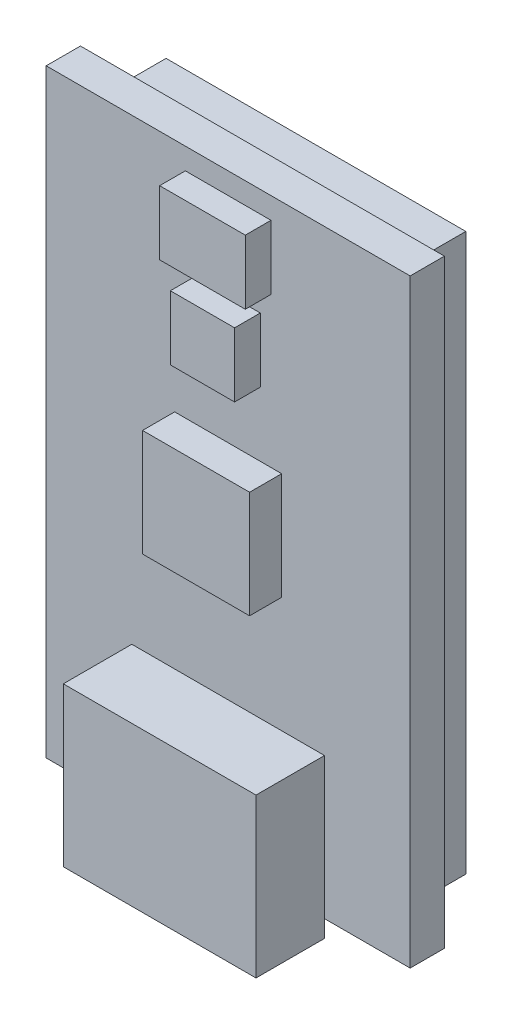
ISO-10303-21;
HEADER;
FILE_DESCRIPTION(('STEP AP214'),'2;1');
FILE_NAME('part.step','',(''),(''),'','','');
FILE_SCHEMA(('AUTOMOTIVE_DESIGN { 1 0 10303 214 1 1 1 1 }'));
ENDSEC;
DATA;
#1=APPLICATION_CONTEXT('core data for automotive mechanical design processes');
#2=APPLICATION_PROTOCOL_DEFINITION('international standard','automotive_design',2000,#1);
#3=PRODUCT_CONTEXT('',#1,'mechanical');
#4=PRODUCT('Part','Part','',(#3));
#5=PRODUCT_RELATED_PRODUCT_CATEGORY('part','',(#4));
#6=PRODUCT_DEFINITION_FORMATION('','',#4);
#7=PRODUCT_DEFINITION_CONTEXT('part definition',#1,'design');
#8=PRODUCT_DEFINITION('design','',#6,#7);
#9=PRODUCT_DEFINITION_SHAPE('','',#8);
#10=(LENGTH_UNIT() NAMED_UNIT(*) SI_UNIT(.MILLI.,.METRE.));
#11=(NAMED_UNIT(*) PLANE_ANGLE_UNIT() SI_UNIT($,.RADIAN.));
#12=(NAMED_UNIT(*) SI_UNIT($,.STERADIAN.) SOLID_ANGLE_UNIT());
#13=UNCERTAINTY_MEASURE_WITH_UNIT(LENGTH_MEASURE(1.E-05),#10,'distance_accuracy_value','');
#14=(GEOMETRIC_REPRESENTATION_CONTEXT(3) GLOBAL_UNCERTAINTY_ASSIGNED_CONTEXT((#13)) GLOBAL_UNIT_ASSIGNED_CONTEXT((#10,
#11,#12)) REPRESENTATION_CONTEXT('',''));
#15=CARTESIAN_POINT('',(0.,0.,0.));
#16=DIRECTION('',(0.,0.,1.));
#17=DIRECTION('',(1.,0.,0.));
#18=AXIS2_PLACEMENT_3D('',#15,#16,#17);
#19=CARTESIAN_POINT('',(0.,0.,14.7));
#20=DIRECTION('',(0.,0.,-1.));
#21=DIRECTION('',(-1.,0.,0.));
#22=AXIS2_PLACEMENT_3D('',#19,#20,#21);
#23=PLANE('',#22);
#24=DIRECTION('',(0.,1.,0.));
#25=VECTOR('',#24,1.);
#26=CARTESIAN_POINT('',(19.5,42.,14.7));
#27=LINE('',#26,#25);
#28=CARTESIAN_POINT('',(19.5,42.,14.7));
#29=VERTEX_POINT('',#28);
#30=CARTESIAN_POINT('',(19.5,45.,14.7));
#31=VERTEX_POINT('',#30);
#32=EDGE_CURVE('E229',#29,#31,#27,.T.);
#33=ORIENTED_EDGE('',*,*,#32,.F.);
#34=DIRECTION('',(1.,0.,0.));
#35=VECTOR('',#34,1.);
#36=CARTESIAN_POINT('',(16.5,42.,14.7));
#37=LINE('',#36,#35);
#38=CARTESIAN_POINT('',(16.5,42.,14.7));
#39=VERTEX_POINT('',#38);
#40=EDGE_CURVE('E242',#39,#29,#37,.T.);
#41=ORIENTED_EDGE('',*,*,#40,.F.);
#42=DIRECTION('',(0.,-1.,0.));
#43=VECTOR('',#42,1.);
#44=CARTESIAN_POINT('',(16.5,42.,14.7));
#45=LINE('',#44,#43);
#46=CARTESIAN_POINT('',(16.5,45.,14.7));
#47=VERTEX_POINT('',#46);
#48=EDGE_CURVE('E251',#47,#39,#45,.T.);
#49=ORIENTED_EDGE('',*,*,#48,.F.);
#50=DIRECTION('',(-1.,0.,0.));
#51=VECTOR('',#50,1.);
#52=CARTESIAN_POINT('',(16.5,45.,14.7));
#53=LINE('',#52,#51);
#54=EDGE_CURVE('E232',#31,#47,#53,.T.);
#55=ORIENTED_EDGE('',*,*,#54,.F.);
#56=EDGE_LOOP('',(#33,#41,#49,#55));
#57=FACE_BOUND('',#56,.T.);
#58=DIRECTION('',(0.,1.,0.));
#59=VECTOR('',#58,1.);
#60=CARTESIAN_POINT('',(22.5,21.2,14.7));
#61=LINE('',#60,#59);
#62=CARTESIAN_POINT('',(22.5,22.,14.7));
#63=VERTEX_POINT('',#62);
#64=CARTESIAN_POINT('',(22.5,28.6,14.7));
#65=VERTEX_POINT('',#64);
#66=EDGE_CURVE('E11',#63,#65,#61,.T.);
#67=ORIENTED_EDGE('',*,*,#66,.F.);
#68=DIRECTION('',(1.,0.,0.));
#69=VECTOR('',#68,1.);
#70=CARTESIAN_POINT('',(9.5,22.,14.7));
#71=LINE('',#70,#69);
#72=CARTESIAN_POINT('',(26.5,22.,14.7));
#73=VERTEX_POINT('',#72);
#74=EDGE_CURVE('E340',#63,#73,#71,.T.);
#75=ORIENTED_EDGE('',*,*,#74,.T.);
#76=DIRECTION('',(0.,1.,0.));
#77=VECTOR('',#76,1.);
#78=CARTESIAN_POINT('',(26.5,22.,14.7));
#79=LINE('',#78,#77);
#80=CARTESIAN_POINT('',(26.5,50.,14.7));
#81=VERTEX_POINT('',#80);
#82=EDGE_CURVE('E332',#73,#81,#79,.T.);
#83=ORIENTED_EDGE('',*,*,#82,.T.);
#84=DIRECTION('',(-1.,0.,0.));
#85=VECTOR('',#84,1.);
#86=CARTESIAN_POINT('',(9.5,50.,14.7));
#87=LINE('',#86,#85);
#88=CARTESIAN_POINT('',(9.5,50.,14.7));
#89=VERTEX_POINT('',#88);
#90=EDGE_CURVE('E335',#81,#89,#87,.T.);
#91=ORIENTED_EDGE('',*,*,#90,.T.);
#92=DIRECTION('',(0.,-1.,0.));
#93=VECTOR('',#92,1.);
#94=CARTESIAN_POINT('',(9.5,22.,14.7));
#95=LINE('',#94,#93);
#96=CARTESIAN_POINT('',(9.5,22.,14.7));
#97=VERTEX_POINT('',#96);
#98=EDGE_CURVE('E338',#89,#97,#95,.T.);
#99=ORIENTED_EDGE('',*,*,#98,.T.);
#100=CARTESIAN_POINT('',(13.5,22.,14.7));
#101=VERTEX_POINT('',#100);
#102=EDGE_CURVE('E341',#97,#101,#71,.T.);
#103=ORIENTED_EDGE('',*,*,#102,.T.);
#104=DIRECTION('',(0.,-1.,0.));
#105=VECTOR('',#104,1.);
#106=CARTESIAN_POINT('',(13.5,21.2,14.7));
#107=LINE('',#106,#105);
#108=CARTESIAN_POINT('',(13.5,28.6,14.7));
#109=VERTEX_POINT('',#108);
#110=EDGE_CURVE('E316',#109,#101,#107,.T.);
#111=ORIENTED_EDGE('',*,*,#110,.F.);
#112=DIRECTION('',(-1.,0.,0.));
#113=VECTOR('',#112,1.);
#114=CARTESIAN_POINT('',(13.5,28.6,14.7));
#115=LINE('',#114,#113);
#116=EDGE_CURVE('E312',#65,#109,#115,.T.);
#117=ORIENTED_EDGE('',*,*,#116,.F.);
#118=EDGE_LOOP('',(#67,#75,#83,#91,#99,#103,#111,#117));
#119=FACE_BOUND('',#118,.T.);
#120=DIRECTION('',(0.,1.,0.));
#121=VECTOR('',#120,1.);
#122=CARTESIAN_POINT('',(20.5,34.,14.7));
#123=LINE('',#122,#121);
#124=CARTESIAN_POINT('',(20.5,34.,14.7));
#125=VERTEX_POINT('',#124);
#126=CARTESIAN_POINT('',(20.5,39.,14.7));
#127=VERTEX_POINT('',#126);
#128=EDGE_CURVE('E267',#125,#127,#123,.T.);
#129=ORIENTED_EDGE('',*,*,#128,.F.);
#130=DIRECTION('',(1.,0.,0.));
#131=VECTOR('',#130,1.);
#132=CARTESIAN_POINT('',(15.5,34.,14.7));
#133=LINE('',#132,#131);
#134=CARTESIAN_POINT('',(15.5,34.,14.7));
#135=VERTEX_POINT('',#134);
#136=EDGE_CURVE('E272',#135,#125,#133,.T.);
#137=ORIENTED_EDGE('',*,*,#136,.F.);
#138=DIRECTION('',(0.,-1.,0.));
#139=VECTOR('',#138,1.);
#140=CARTESIAN_POINT('',(15.5,34.,14.7));
#141=LINE('',#140,#139);
#142=CARTESIAN_POINT('',(15.5,39.,14.7));
#143=VERTEX_POINT('',#142);
#144=EDGE_CURVE('E284',#143,#135,#141,.T.);
#145=ORIENTED_EDGE('',*,*,#144,.F.);
#146=DIRECTION('',(-1.,0.,0.));
#147=VECTOR('',#146,1.);
#148=CARTESIAN_POINT('',(15.5,39.,14.7));
#149=LINE('',#148,#147);
#150=EDGE_CURVE('E281',#127,#143,#149,.T.);
#151=ORIENTED_EDGE('',*,*,#150,.F.);
#152=EDGE_LOOP('',(#129,#137,#145,#151));
#153=FACE_BOUND('',#152,.T.);
#154=DIRECTION('',(0.,1.,0.));
#155=VECTOR('',#154,1.);
#156=CARTESIAN_POINT('',(20.,46.,14.7));
#157=LINE('',#156,#155);
#158=CARTESIAN_POINT('',(20.,46.,14.7));
#159=VERTEX_POINT('',#158);
#160=CARTESIAN_POINT('',(20.,49.,14.7));
#161=VERTEX_POINT('',#160);
#162=EDGE_CURVE('E228',#159,#161,#157,.T.);
#163=ORIENTED_EDGE('',*,*,#162,.F.);
#164=DIRECTION('',(1.,0.,0.));
#165=VECTOR('',#164,1.);
#166=CARTESIAN_POINT('',(16.,46.,14.7));
#167=LINE('',#166,#165);
#168=CARTESIAN_POINT('',(16.,46.,14.7));
#169=VERTEX_POINT('',#168);
#170=EDGE_CURVE('E225',#169,#159,#167,.T.);
#171=ORIENTED_EDGE('',*,*,#170,.F.);
#172=DIRECTION('',(0.,-1.,0.));
#173=VECTOR('',#172,1.);
#174=CARTESIAN_POINT('',(16.,46.,14.7));
#175=LINE('',#174,#173);
#176=CARTESIAN_POINT('',(16.,49.,14.7));
#177=VERTEX_POINT('',#176);
#178=EDGE_CURVE('E61',#177,#169,#175,.T.);
#179=ORIENTED_EDGE('',*,*,#178,.F.);
#180=DIRECTION('',(-1.,0.,0.));
#181=VECTOR('',#180,1.);
#182=CARTESIAN_POINT('',(16.,49.,14.7));
#183=LINE('',#182,#181);
#184=EDGE_CURVE('E56',#161,#177,#183,.T.);
#185=ORIENTED_EDGE('',*,*,#184,.F.);
#186=EDGE_LOOP('',(#163,#171,#179,#185));
#187=FACE_BOUND('',#186,.T.);
#188=ADVANCED_FACE('F39',(#57,#119,#153,#187),#23,.F.);
#189=CARTESIAN_POINT('',(25.,23.,13.1));
#190=DIRECTION('',(-1.,0.,0.));
#191=DIRECTION('',(0.,0.,1.));
#192=AXIS2_PLACEMENT_3D('',#189,#190,#191);
#193=PLANE('',#192);
#194=DIRECTION('',(0.,1.,0.));
#195=VECTOR('',#194,1.);
#196=CARTESIAN_POINT('',(25.,23.,10.6));
#197=LINE('',#196,#195);
#198=CARTESIAN_POINT('',(25.,23.,10.6));
#199=VERTEX_POINT('',#198);
#200=CARTESIAN_POINT('',(25.,49.,10.6));
#201=VERTEX_POINT('',#200);
#202=EDGE_CURVE('E364',#199,#201,#197,.T.);
#203=ORIENTED_EDGE('',*,*,#202,.T.);
#204=DIRECTION('',(0.,0.,-1.));
#205=VECTOR('',#204,1.);
#206=CARTESIAN_POINT('',(25.,49.,13.1));
#207=LINE('',#206,#205);
#208=CARTESIAN_POINT('',(25.,49.,13.1));
#209=VERTEX_POINT('',#208);
#210=EDGE_CURVE('E43',#209,#201,#207,.T.);
#211=ORIENTED_EDGE('',*,*,#210,.F.);
#212=DIRECTION('',(0.,1.,0.));
#213=VECTOR('',#212,1.);
#214=CARTESIAN_POINT('',(25.,23.,13.1));
#215=LINE('',#214,#213);
#216=CARTESIAN_POINT('',(25.,23.,13.1));
#217=VERTEX_POINT('',#216);
#218=EDGE_CURVE('E365',#217,#209,#215,.T.);
#219=ORIENTED_EDGE('',*,*,#218,.F.);
#220=DIRECTION('',(0.,0.,-1.));
#221=VECTOR('',#220,1.);
#222=CARTESIAN_POINT('',(25.,23.,13.1));
#223=LINE('',#222,#221);
#224=EDGE_CURVE('E378',#217,#199,#223,.T.);
#225=ORIENTED_EDGE('',*,*,#224,.T.);
#226=EDGE_LOOP('',(#203,#211,#219,#225));
#227=FACE_BOUND('',#226,.T.);
#228=ADVANCED_FACE('F41',(#227),#193,.F.);
#229=CARTESIAN_POINT('',(11.,49.,13.1));
#230=DIRECTION('',(0.,-1.,0.));
#231=DIRECTION('',(0.,0.,-1.));
#232=AXIS2_PLACEMENT_3D('',#229,#230,#231);
#233=PLANE('',#232);
#234=DIRECTION('',(-1.,0.,0.));
#235=VECTOR('',#234,1.);
#236=CARTESIAN_POINT('',(11.,49.,10.6));
#237=LINE('',#236,#235);
#238=CARTESIAN_POINT('',(11.,49.,10.6));
#239=VERTEX_POINT('',#238);
#240=EDGE_CURVE('E381',#201,#239,#237,.T.);
#241=ORIENTED_EDGE('',*,*,#240,.T.);
#242=DIRECTION('',(0.,0.,-1.));
#243=VECTOR('',#242,1.);
#244=CARTESIAN_POINT('',(11.,49.,13.1));
#245=LINE('',#244,#243);
#246=CARTESIAN_POINT('',(11.,49.,13.1));
#247=VERTEX_POINT('',#246);
#248=EDGE_CURVE('E390',#247,#239,#245,.T.);
#249=ORIENTED_EDGE('',*,*,#248,.F.);
#250=DIRECTION('',(-1.,0.,0.));
#251=VECTOR('',#250,1.);
#252=CARTESIAN_POINT('',(11.,49.,13.1));
#253=LINE('',#252,#251);
#254=EDGE_CURVE('E368',#209,#247,#253,.T.);
#255=ORIENTED_EDGE('',*,*,#254,.F.);
#256=ORIENTED_EDGE('',*,*,#210,.T.);
#257=EDGE_LOOP('',(#241,#249,#255,#256));
#258=FACE_BOUND('',#257,.T.);
#259=ADVANCED_FACE('F398',(#258),#233,.F.);
#260=CARTESIAN_POINT('',(11.,23.,13.1));
#261=DIRECTION('',(1.,0.,0.));
#262=DIRECTION('',(0.,0.,-1.));
#263=AXIS2_PLACEMENT_3D('',#260,#261,#262);
#264=PLANE('',#263);
#265=DIRECTION('',(0.,-1.,0.));
#266=VECTOR('',#265,1.);
#267=CARTESIAN_POINT('',(11.,23.,10.6));
#268=LINE('',#267,#266);
#269=CARTESIAN_POINT('',(11.,23.,10.6));
#270=VERTEX_POINT('',#269);
#271=EDGE_CURVE('E383',#239,#270,#268,.T.);
#272=ORIENTED_EDGE('',*,*,#271,.T.);
#273=DIRECTION('',(0.,0.,-1.));
#274=VECTOR('',#273,1.);
#275=CARTESIAN_POINT('',(11.,23.,13.1));
#276=LINE('',#275,#274);
#277=CARTESIAN_POINT('',(11.,23.,13.1));
#278=VERTEX_POINT('',#277);
#279=EDGE_CURVE('E388',#278,#270,#276,.T.);
#280=ORIENTED_EDGE('',*,*,#279,.F.);
#281=DIRECTION('',(0.,-1.,0.));
#282=VECTOR('',#281,1.);
#283=CARTESIAN_POINT('',(11.,23.,13.1));
#284=LINE('',#283,#282);
#285=EDGE_CURVE('E372',#247,#278,#284,.T.);
#286=ORIENTED_EDGE('',*,*,#285,.F.);
#287=ORIENTED_EDGE('',*,*,#248,.T.);
#288=EDGE_LOOP('',(#272,#280,#286,#287));
#289=FACE_BOUND('',#288,.T.);
#290=ADVANCED_FACE('F405',(#289),#264,.F.);
#291=CARTESIAN_POINT('',(11.,23.,13.1));
#292=DIRECTION('',(0.,1.,0.));
#293=DIRECTION('',(0.,0.,1.));
#294=AXIS2_PLACEMENT_3D('',#291,#292,#293);
#295=PLANE('',#294);
#296=DIRECTION('',(1.,0.,0.));
#297=VECTOR('',#296,1.);
#298=CARTESIAN_POINT('',(11.,23.,10.6));
#299=LINE('',#298,#297);
#300=EDGE_CURVE('E369',#270,#199,#299,.T.);
#301=ORIENTED_EDGE('',*,*,#300,.T.);
#302=ORIENTED_EDGE('',*,*,#224,.F.);
#303=DIRECTION('',(1.,0.,0.));
#304=VECTOR('',#303,1.);
#305=CARTESIAN_POINT('',(11.,23.,13.1));
#306=LINE('',#305,#304);
#307=EDGE_CURVE('E375',#278,#217,#306,.T.);
#308=ORIENTED_EDGE('',*,*,#307,.F.);
#309=ORIENTED_EDGE('',*,*,#279,.T.);
#310=EDGE_LOOP('',(#301,#302,#308,#309));
#311=FACE_BOUND('',#310,.T.);
#312=ADVANCED_FACE('F408',(#311),#295,.F.);
#313=CARTESIAN_POINT('',(0.,0.,10.6));
#314=DIRECTION('',(0.,0.,-1.));
#315=DIRECTION('',(-1.,0.,0.));
#316=AXIS2_PLACEMENT_3D('',#313,#314,#315);
#317=PLANE('',#316);
#318=ORIENTED_EDGE('',*,*,#202,.F.);
#319=ORIENTED_EDGE('',*,*,#300,.F.);
#320=ORIENTED_EDGE('',*,*,#271,.F.);
#321=ORIENTED_EDGE('',*,*,#240,.F.);
#322=EDGE_LOOP('',(#318,#319,#320,#321));
#323=FACE_BOUND('',#322,.T.);
#324=ADVANCED_FACE('F404',(#323),#317,.T.);
#325=CARTESIAN_POINT('',(26.5,22.,14.7));
#326=DIRECTION('',(-1.,0.,0.));
#327=DIRECTION('',(0.,0.,1.));
#328=AXIS2_PLACEMENT_3D('',#325,#326,#327);
#329=PLANE('',#328);
#330=DIRECTION('',(0.,1.,0.));
#331=VECTOR('',#330,1.);
#332=CARTESIAN_POINT('',(26.5,22.,13.1));
#333=LINE('',#332,#331);
#334=CARTESIAN_POINT('',(26.5,22.,13.1));
#335=VERTEX_POINT('',#334);
#336=CARTESIAN_POINT('',(26.5,50.,13.1));
#337=VERTEX_POINT('',#336);
#338=EDGE_CURVE('E331',#335,#337,#333,.T.);
#339=ORIENTED_EDGE('',*,*,#338,.T.);
#340=DIRECTION('',(0.,0.,-1.));
#341=VECTOR('',#340,1.);
#342=CARTESIAN_POINT('',(26.5,50.,14.7));
#343=LINE('',#342,#341);
#344=EDGE_CURVE('E361',#81,#337,#343,.T.);
#345=ORIENTED_EDGE('',*,*,#344,.F.);
#346=ORIENTED_EDGE('',*,*,#82,.F.);
#347=DIRECTION('',(0.,0.,-1.));
#348=VECTOR('',#347,1.);
#349=CARTESIAN_POINT('',(26.5,22.,14.7));
#350=LINE('',#349,#348);
#351=EDGE_CURVE('E344',#73,#335,#350,.T.);
#352=ORIENTED_EDGE('',*,*,#351,.T.);
#353=EDGE_LOOP('',(#339,#345,#346,#352));
#354=FACE_BOUND('',#353,.T.);
#355=ADVANCED_FACE('F421',(#354),#329,.F.);
#356=CARTESIAN_POINT('',(9.5,50.,14.7));
#357=DIRECTION('',(0.,-1.,0.));
#358=DIRECTION('',(0.,0.,-1.));
#359=AXIS2_PLACEMENT_3D('',#356,#357,#358);
#360=PLANE('',#359);
#361=DIRECTION('',(-1.,0.,0.));
#362=VECTOR('',#361,1.);
#363=CARTESIAN_POINT('',(9.5,50.,13.1));
#364=LINE('',#363,#362);
#365=CARTESIAN_POINT('',(9.5,50.,13.1));
#366=VERTEX_POINT('',#365);
#367=EDGE_CURVE('E348',#337,#366,#364,.T.);
#368=ORIENTED_EDGE('',*,*,#367,.T.);
#369=DIRECTION('',(0.,0.,-1.));
#370=VECTOR('',#369,1.);
#371=CARTESIAN_POINT('',(9.5,50.,14.7));
#372=LINE('',#371,#370);
#373=EDGE_CURVE('E358',#89,#366,#372,.T.);
#374=ORIENTED_EDGE('',*,*,#373,.F.);
#375=ORIENTED_EDGE('',*,*,#90,.F.);
#376=ORIENTED_EDGE('',*,*,#344,.T.);
#377=EDGE_LOOP('',(#368,#374,#375,#376));
#378=FACE_BOUND('',#377,.T.);
#379=ADVANCED_FACE('F434',(#378),#360,.F.);
#380=CARTESIAN_POINT('',(9.5,22.,14.7));
#381=DIRECTION('',(1.,0.,0.));
#382=DIRECTION('',(0.,0.,-1.));
#383=AXIS2_PLACEMENT_3D('',#380,#381,#382);
#384=PLANE('',#383);
#385=DIRECTION('',(0.,-1.,0.));
#386=VECTOR('',#385,1.);
#387=CARTESIAN_POINT('',(9.5,22.,13.1));
#388=LINE('',#387,#386);
#389=CARTESIAN_POINT('',(9.5,22.,13.1));
#390=VERTEX_POINT('',#389);
#391=EDGE_CURVE('E350',#366,#390,#388,.T.);
#392=ORIENTED_EDGE('',*,*,#391,.T.);
#393=DIRECTION('',(0.,0.,-1.));
#394=VECTOR('',#393,1.);
#395=CARTESIAN_POINT('',(9.5,22.,14.7));
#396=LINE('',#395,#394);
#397=EDGE_CURVE('E355',#97,#390,#396,.T.);
#398=ORIENTED_EDGE('',*,*,#397,.F.);
#399=ORIENTED_EDGE('',*,*,#98,.F.);
#400=ORIENTED_EDGE('',*,*,#373,.T.);
#401=EDGE_LOOP('',(#392,#398,#399,#400));
#402=FACE_BOUND('',#401,.T.);
#403=ADVANCED_FACE('F431',(#402),#384,.F.);
#404=CARTESIAN_POINT('',(9.5,22.,14.7));
#405=DIRECTION('',(0.,1.,0.));
#406=DIRECTION('',(0.,0.,1.));
#407=AXIS2_PLACEMENT_3D('',#404,#405,#406);
#408=PLANE('',#407);
#409=DIRECTION('',(1.,0.,0.));
#410=VECTOR('',#409,1.);
#411=CARTESIAN_POINT('',(9.5,22.,13.1));
#412=LINE('',#411,#410);
#413=EDGE_CURVE('E336',#390,#335,#412,.T.);
#414=ORIENTED_EDGE('',*,*,#413,.T.);
#415=ORIENTED_EDGE('',*,*,#351,.F.);
#416=ORIENTED_EDGE('',*,*,#74,.F.);
#417=EDGE_CURVE('E345',#101,#63,#71,.T.);
#418=ORIENTED_EDGE('',*,*,#417,.F.);
#419=ORIENTED_EDGE('',*,*,#102,.F.);
#420=ORIENTED_EDGE('',*,*,#397,.T.);
#421=EDGE_LOOP('',(#414,#415,#416,#418,#419,#420));
#422=FACE_BOUND('',#421,.T.);
#423=ADVANCED_FACE('F414',(#422),#408,.F.);
#424=CARTESIAN_POINT('',(0.,0.,13.1));
#425=DIRECTION('',(0.,0.,-1.));
#426=DIRECTION('',(-1.,0.,0.));
#427=AXIS2_PLACEMENT_3D('',#424,#425,#426);
#428=PLANE('',#427);
#429=ORIENTED_EDGE('',*,*,#307,.T.);
#430=ORIENTED_EDGE('',*,*,#218,.T.);
#431=ORIENTED_EDGE('',*,*,#254,.T.);
#432=ORIENTED_EDGE('',*,*,#285,.T.);
#433=EDGE_LOOP('',(#429,#430,#431,#432));
#434=FACE_BOUND('',#433,.T.);
#435=ORIENTED_EDGE('',*,*,#338,.F.);
#436=ORIENTED_EDGE('',*,*,#413,.F.);
#437=ORIENTED_EDGE('',*,*,#391,.F.);
#438=ORIENTED_EDGE('',*,*,#367,.F.);
#439=EDGE_LOOP('',(#435,#436,#437,#438));
#440=FACE_BOUND('',#439,.T.);
#441=ADVANCED_FACE('F410',(#434,#440),#428,.T.);
#442=CARTESIAN_POINT('',(22.5,21.2,17.9));
#443=DIRECTION('',(-1.,0.,0.));
#444=DIRECTION('',(0.,0.,1.));
#445=AXIS2_PLACEMENT_3D('',#442,#443,#444);
#446=PLANE('',#445);
#447=CARTESIAN_POINT('',(22.5,21.2,14.7));
#448=VERTEX_POINT('',#447);
#449=EDGE_CURVE('E49',#448,#63,#61,.T.);
#450=ORIENTED_EDGE('',*,*,#449,.T.);
#451=ORIENTED_EDGE('',*,*,#66,.T.);
#452=DIRECTION('',(0.,0.,-1.));
#453=VECTOR('',#452,1.);
#454=CARTESIAN_POINT('',(22.5,28.6,17.9));
#455=LINE('',#454,#453);
#456=CARTESIAN_POINT('',(22.5,28.6,17.9));
#457=VERTEX_POINT('',#456);
#458=EDGE_CURVE('E328',#457,#65,#455,.T.);
#459=ORIENTED_EDGE('',*,*,#458,.F.);
#460=DIRECTION('',(0.,1.,0.));
#461=VECTOR('',#460,1.);
#462=CARTESIAN_POINT('',(22.5,21.2,17.9));
#463=LINE('',#462,#461);
#464=CARTESIAN_POINT('',(22.5,21.2,17.9));
#465=VERTEX_POINT('',#464);
#466=EDGE_CURVE('E300',#465,#457,#463,.T.);
#467=ORIENTED_EDGE('',*,*,#466,.F.);
#468=DIRECTION('',(0.,0.,-1.));
#469=VECTOR('',#468,1.);
#470=CARTESIAN_POINT('',(22.5,21.2,17.9));
#471=LINE('',#470,#469);
#472=EDGE_CURVE('E309',#465,#448,#471,.T.);
#473=ORIENTED_EDGE('',*,*,#472,.T.);
#474=EDGE_LOOP('',(#450,#451,#459,#467,#473));
#475=FACE_BOUND('',#474,.T.);
#476=ADVANCED_FACE('F413',(#475),#446,.F.);
#477=CARTESIAN_POINT('',(13.5,28.6,17.9));
#478=DIRECTION('',(0.,-1.,0.));
#479=DIRECTION('',(0.,0.,-1.));
#480=AXIS2_PLACEMENT_3D('',#477,#478,#479);
#481=PLANE('',#480);
#482=ORIENTED_EDGE('',*,*,#116,.T.);
#483=DIRECTION('',(0.,0.,-1.));
#484=VECTOR('',#483,1.);
#485=CARTESIAN_POINT('',(13.5,28.6,17.9));
#486=LINE('',#485,#484);
#487=CARTESIAN_POINT('',(13.5,28.6,17.9));
#488=VERTEX_POINT('',#487);
#489=EDGE_CURVE('E325',#488,#109,#486,.T.);
#490=ORIENTED_EDGE('',*,*,#489,.F.);
#491=DIRECTION('',(-1.,0.,0.));
#492=VECTOR('',#491,1.);
#493=CARTESIAN_POINT('',(13.5,28.6,17.9));
#494=LINE('',#493,#492);
#495=EDGE_CURVE('E303',#457,#488,#494,.T.);
#496=ORIENTED_EDGE('',*,*,#495,.F.);
#497=ORIENTED_EDGE('',*,*,#458,.T.);
#498=EDGE_LOOP('',(#482,#490,#496,#497));
#499=FACE_BOUND('',#498,.T.);
#500=ADVANCED_FACE('F455',(#499),#481,.F.);
#501=CARTESIAN_POINT('',(13.5,21.2,17.9));
#502=DIRECTION('',(1.,0.,0.));
#503=DIRECTION('',(0.,0.,-1.));
#504=AXIS2_PLACEMENT_3D('',#501,#502,#503);
#505=PLANE('',#504);
#506=ORIENTED_EDGE('',*,*,#110,.T.);
#507=CARTESIAN_POINT('',(13.5,21.2,14.7));
#508=VERTEX_POINT('',#507);
#509=EDGE_CURVE('E315',#101,#508,#107,.T.);
#510=ORIENTED_EDGE('',*,*,#509,.T.);
#511=DIRECTION('',(0.,0.,-1.));
#512=VECTOR('',#511,1.);
#513=CARTESIAN_POINT('',(13.5,21.2,17.9));
#514=LINE('',#513,#512);
#515=CARTESIAN_POINT('',(13.5,21.2,17.9));
#516=VERTEX_POINT('',#515);
#517=EDGE_CURVE('E322',#516,#508,#514,.T.);
#518=ORIENTED_EDGE('',*,*,#517,.F.);
#519=DIRECTION('',(0.,-1.,0.));
#520=VECTOR('',#519,1.);
#521=CARTESIAN_POINT('',(13.5,21.2,17.9));
#522=LINE('',#521,#520);
#523=EDGE_CURVE('E306',#488,#516,#522,.T.);
#524=ORIENTED_EDGE('',*,*,#523,.F.);
#525=ORIENTED_EDGE('',*,*,#489,.T.);
#526=EDGE_LOOP('',(#506,#510,#518,#524,#525));
#527=FACE_BOUND('',#526,.T.);
#528=ADVANCED_FACE('F452',(#527),#505,.F.);
#529=CARTESIAN_POINT('',(13.5,21.2,17.9));
#530=DIRECTION('',(0.,1.,0.));
#531=DIRECTION('',(0.,0.,1.));
#532=AXIS2_PLACEMENT_3D('',#529,#530,#531);
#533=PLANE('',#532);
#534=DIRECTION('',(1.,0.,0.));
#535=VECTOR('',#534,1.);
#536=CARTESIAN_POINT('',(13.5,21.2,14.7));
#537=LINE('',#536,#535);
#538=EDGE_CURVE('E304',#508,#448,#537,.T.);
#539=ORIENTED_EDGE('',*,*,#538,.T.);
#540=ORIENTED_EDGE('',*,*,#472,.F.);
#541=DIRECTION('',(1.,0.,0.));
#542=VECTOR('',#541,1.);
#543=CARTESIAN_POINT('',(13.5,21.2,17.9));
#544=LINE('',#543,#542);
#545=EDGE_CURVE('E308',#516,#465,#544,.T.);
#546=ORIENTED_EDGE('',*,*,#545,.F.);
#547=ORIENTED_EDGE('',*,*,#517,.T.);
#548=EDGE_LOOP('',(#539,#540,#546,#547));
#549=FACE_BOUND('',#548,.T.);
#550=ADVANCED_FACE('F448',(#549),#533,.F.);
#551=CARTESIAN_POINT('',(0.,0.,17.9));
#552=DIRECTION('',(0.,0.,-1.));
#553=DIRECTION('',(-1.,0.,0.));
#554=AXIS2_PLACEMENT_3D('',#551,#552,#553);
#555=PLANE('',#554);
#556=ORIENTED_EDGE('',*,*,#466,.T.);
#557=ORIENTED_EDGE('',*,*,#495,.T.);
#558=ORIENTED_EDGE('',*,*,#523,.T.);
#559=ORIENTED_EDGE('',*,*,#545,.T.);
#560=EDGE_LOOP('',(#556,#557,#558,#559));
#561=FACE_BOUND('',#560,.T.);
#562=ADVANCED_FACE('F457',(#561),#555,.F.);
#563=CARTESIAN_POINT('',(0.,0.,14.7));
#564=DIRECTION('',(0.,0.,-1.));
#565=DIRECTION('',(-1.,0.,0.));
#566=AXIS2_PLACEMENT_3D('',#563,#564,#565);
#567=PLANE('',#566);
#568=ORIENTED_EDGE('',*,*,#509,.F.);
#569=ORIENTED_EDGE('',*,*,#417,.T.);
#570=ORIENTED_EDGE('',*,*,#449,.F.);
#571=ORIENTED_EDGE('',*,*,#538,.F.);
#572=EDGE_LOOP('',(#568,#569,#570,#571));
#573=FACE_BOUND('',#572,.T.);
#574=ADVANCED_FACE('F440',(#573),#567,.T.);
#575=CARTESIAN_POINT('',(20.5,34.,16.2));
#576=DIRECTION('',(-1.,0.,0.));
#577=DIRECTION('',(0.,0.,1.));
#578=AXIS2_PLACEMENT_3D('',#575,#576,#577);
#579=PLANE('',#578);
#580=ORIENTED_EDGE('',*,*,#128,.T.);
#581=DIRECTION('',(0.,0.,-1.));
#582=VECTOR('',#581,1.);
#583=CARTESIAN_POINT('',(20.5,39.,16.2));
#584=LINE('',#583,#582);
#585=CARTESIAN_POINT('',(20.5,39.,16.2));
#586=VERTEX_POINT('',#585);
#587=EDGE_CURVE('E297',#586,#127,#584,.T.);
#588=ORIENTED_EDGE('',*,*,#587,.F.);
#589=DIRECTION('',(0.,1.,0.));
#590=VECTOR('',#589,1.);
#591=CARTESIAN_POINT('',(20.5,34.,16.2));
#592=LINE('',#591,#590);
#593=CARTESIAN_POINT('',(20.5,34.,16.2));
#594=VERTEX_POINT('',#593);
#595=EDGE_CURVE('E268',#594,#586,#592,.T.);
#596=ORIENTED_EDGE('',*,*,#595,.F.);
#597=DIRECTION('',(0.,0.,-1.));
#598=VECTOR('',#597,1.);
#599=CARTESIAN_POINT('',(20.5,34.,16.2));
#600=LINE('',#599,#598);
#601=EDGE_CURVE('E278',#594,#125,#600,.T.);
#602=ORIENTED_EDGE('',*,*,#601,.T.);
#603=EDGE_LOOP('',(#580,#588,#596,#602));
#604=FACE_BOUND('',#603,.T.);
#605=ADVANCED_FACE('F464',(#604),#579,.F.);
#606=CARTESIAN_POINT('',(15.5,39.,16.2));
#607=DIRECTION('',(0.,-1.,0.));
#608=DIRECTION('',(0.,0.,-1.));
#609=AXIS2_PLACEMENT_3D('',#606,#607,#608);
#610=PLANE('',#609);
#611=ORIENTED_EDGE('',*,*,#150,.T.);
#612=DIRECTION('',(0.,0.,-1.));
#613=VECTOR('',#612,1.);
#614=CARTESIAN_POINT('',(15.5,39.,16.2));
#615=LINE('',#614,#613);
#616=CARTESIAN_POINT('',(15.5,39.,16.2));
#617=VERTEX_POINT('',#616);
#618=EDGE_CURVE('E294',#617,#143,#615,.T.);
#619=ORIENTED_EDGE('',*,*,#618,.F.);
#620=DIRECTION('',(-1.,0.,0.));
#621=VECTOR('',#620,1.);
#622=CARTESIAN_POINT('',(15.5,39.,16.2));
#623=LINE('',#622,#621);
#624=EDGE_CURVE('E271',#586,#617,#623,.T.);
#625=ORIENTED_EDGE('',*,*,#624,.F.);
#626=ORIENTED_EDGE('',*,*,#587,.T.);
#627=EDGE_LOOP('',(#611,#619,#625,#626));
#628=FACE_BOUND('',#627,.T.);
#629=ADVANCED_FACE('F566',(#628),#610,.F.);
#630=CARTESIAN_POINT('',(15.5,34.,16.2));
#631=DIRECTION('',(1.,0.,0.));
#632=DIRECTION('',(0.,0.,-1.));
#633=AXIS2_PLACEMENT_3D('',#630,#631,#632);
#634=PLANE('',#633);
#635=ORIENTED_EDGE('',*,*,#144,.T.);
#636=DIRECTION('',(0.,0.,-1.));
#637=VECTOR('',#636,1.);
#638=CARTESIAN_POINT('',(15.5,34.,16.2));
#639=LINE('',#638,#637);
#640=CARTESIAN_POINT('',(15.5,34.,16.2));
#641=VERTEX_POINT('',#640);
#642=EDGE_CURVE('E291',#641,#135,#639,.T.);
#643=ORIENTED_EDGE('',*,*,#642,.F.);
#644=DIRECTION('',(0.,-1.,0.));
#645=VECTOR('',#644,1.);
#646=CARTESIAN_POINT('',(15.5,34.,16.2));
#647=LINE('',#646,#645);
#648=EDGE_CURVE('E274',#617,#641,#647,.T.);
#649=ORIENTED_EDGE('',*,*,#648,.F.);
#650=ORIENTED_EDGE('',*,*,#618,.T.);
#651=EDGE_LOOP('',(#635,#643,#649,#650));
#652=FACE_BOUND('',#651,.T.);
#653=ADVANCED_FACE('F575',(#652),#634,.F.);
#654=CARTESIAN_POINT('',(15.5,34.,16.2));
#655=DIRECTION('',(0.,1.,0.));
#656=DIRECTION('',(0.,0.,1.));
#657=AXIS2_PLACEMENT_3D('',#654,#655,#656);
#658=PLANE('',#657);
#659=ORIENTED_EDGE('',*,*,#136,.T.);
#660=ORIENTED_EDGE('',*,*,#601,.F.);
#661=DIRECTION('',(1.,0.,0.));
#662=VECTOR('',#661,1.);
#663=CARTESIAN_POINT('',(15.5,34.,16.2));
#664=LINE('',#663,#662);
#665=EDGE_CURVE('E276',#641,#594,#664,.T.);
#666=ORIENTED_EDGE('',*,*,#665,.F.);
#667=ORIENTED_EDGE('',*,*,#642,.T.);
#668=EDGE_LOOP('',(#659,#660,#666,#667));
#669=FACE_BOUND('',#668,.T.);
#670=ADVANCED_FACE('F585',(#669),#658,.F.);
#671=CARTESIAN_POINT('',(0.,0.,16.2));
#672=DIRECTION('',(0.,0.,-1.));
#673=DIRECTION('',(-1.,0.,0.));
#674=AXIS2_PLACEMENT_3D('',#671,#672,#673);
#675=PLANE('',#674);
#676=ORIENTED_EDGE('',*,*,#595,.T.);
#677=ORIENTED_EDGE('',*,*,#624,.T.);
#678=ORIENTED_EDGE('',*,*,#648,.T.);
#679=ORIENTED_EDGE('',*,*,#665,.T.);
#680=EDGE_LOOP('',(#676,#677,#678,#679));
#681=FACE_BOUND('',#680,.T.);
#682=ADVANCED_FACE('F595',(#681),#675,.F.);
#683=CARTESIAN_POINT('',(19.5,42.,15.9));
#684=DIRECTION('',(-1.,0.,0.));
#685=DIRECTION('',(0.,0.,1.));
#686=AXIS2_PLACEMENT_3D('',#683,#684,#685);
#687=PLANE('',#686);
#688=ORIENTED_EDGE('',*,*,#32,.T.);
#689=DIRECTION('',(0.,0.,-1.));
#690=VECTOR('',#689,1.);
#691=CARTESIAN_POINT('',(19.5,45.,15.9));
#692=LINE('',#691,#690);
#693=CARTESIAN_POINT('',(19.5,45.,15.9));
#694=VERTEX_POINT('',#693);
#695=EDGE_CURVE('E264',#694,#31,#692,.T.);
#696=ORIENTED_EDGE('',*,*,#695,.F.);
#697=DIRECTION('',(0.,1.,0.));
#698=VECTOR('',#697,1.);
#699=CARTESIAN_POINT('',(19.5,42.,15.9));
#700=LINE('',#699,#698);
#701=CARTESIAN_POINT('',(19.5,42.,15.9));
#702=VERTEX_POINT('',#701);
#703=EDGE_CURVE('E238',#702,#694,#700,.T.);
#704=ORIENTED_EDGE('',*,*,#703,.F.);
#705=DIRECTION('',(0.,0.,-1.));
#706=VECTOR('',#705,1.);
#707=CARTESIAN_POINT('',(19.5,42.,15.9));
#708=LINE('',#707,#706);
#709=EDGE_CURVE('E247',#702,#29,#708,.T.);
#710=ORIENTED_EDGE('',*,*,#709,.T.);
#711=EDGE_LOOP('',(#688,#696,#704,#710));
#712=FACE_BOUND('',#711,.T.);
#713=ADVANCED_FACE('F605',(#712),#687,.F.);
#714=CARTESIAN_POINT('',(16.5,45.,15.9));
#715=DIRECTION('',(0.,-1.,0.));
#716=DIRECTION('',(0.,0.,-1.));
#717=AXIS2_PLACEMENT_3D('',#714,#715,#716);
#718=PLANE('',#717);
#719=ORIENTED_EDGE('',*,*,#54,.T.);
#720=DIRECTION('',(0.,0.,-1.));
#721=VECTOR('',#720,1.);
#722=CARTESIAN_POINT('',(16.5,45.,15.9));
#723=LINE('',#722,#721);
#724=CARTESIAN_POINT('',(16.5,45.,15.9));
#725=VERTEX_POINT('',#724);
#726=EDGE_CURVE('E261',#725,#47,#723,.T.);
#727=ORIENTED_EDGE('',*,*,#726,.F.);
#728=DIRECTION('',(-1.,0.,0.));
#729=VECTOR('',#728,1.);
#730=CARTESIAN_POINT('',(16.5,45.,15.9));
#731=LINE('',#730,#729);
#732=EDGE_CURVE('E241',#694,#725,#731,.T.);
#733=ORIENTED_EDGE('',*,*,#732,.F.);
#734=ORIENTED_EDGE('',*,*,#695,.T.);
#735=EDGE_LOOP('',(#719,#727,#733,#734));
#736=FACE_BOUND('',#735,.T.);
#737=ADVANCED_FACE('F615',(#736),#718,.F.);
#738=CARTESIAN_POINT('',(16.5,42.,15.9));
#739=DIRECTION('',(1.,0.,0.));
#740=DIRECTION('',(0.,0.,-1.));
#741=AXIS2_PLACEMENT_3D('',#738,#739,#740);
#742=PLANE('',#741);
#743=ORIENTED_EDGE('',*,*,#48,.T.);
#744=DIRECTION('',(0.,0.,-1.));
#745=VECTOR('',#744,1.);
#746=CARTESIAN_POINT('',(16.5,42.,15.9));
#747=LINE('',#746,#745);
#748=CARTESIAN_POINT('',(16.5,42.,15.9));
#749=VERTEX_POINT('',#748);
#750=EDGE_CURVE('E258',#749,#39,#747,.T.);
#751=ORIENTED_EDGE('',*,*,#750,.F.);
#752=DIRECTION('',(0.,-1.,0.));
#753=VECTOR('',#752,1.);
#754=CARTESIAN_POINT('',(16.5,42.,15.9));
#755=LINE('',#754,#753);
#756=EDGE_CURVE('E244',#725,#749,#755,.T.);
#757=ORIENTED_EDGE('',*,*,#756,.F.);
#758=ORIENTED_EDGE('',*,*,#726,.T.);
#759=EDGE_LOOP('',(#743,#751,#757,#758));
#760=FACE_BOUND('',#759,.T.);
#761=ADVANCED_FACE('F625',(#760),#742,.F.);
#762=CARTESIAN_POINT('',(16.5,42.,15.9));
#763=DIRECTION('',(0.,1.,0.));
#764=DIRECTION('',(0.,0.,1.));
#765=AXIS2_PLACEMENT_3D('',#762,#763,#764);
#766=PLANE('',#765);
#767=ORIENTED_EDGE('',*,*,#40,.T.);
#768=ORIENTED_EDGE('',*,*,#709,.F.);
#769=DIRECTION('',(1.,0.,0.));
#770=VECTOR('',#769,1.);
#771=CARTESIAN_POINT('',(16.5,42.,15.9));
#772=LINE('',#771,#770);
#773=EDGE_CURVE('E246',#749,#702,#772,.T.);
#774=ORIENTED_EDGE('',*,*,#773,.F.);
#775=ORIENTED_EDGE('',*,*,#750,.T.);
#776=EDGE_LOOP('',(#767,#768,#774,#775));
#777=FACE_BOUND('',#776,.T.);
#778=ADVANCED_FACE('F635',(#777),#766,.F.);
#779=CARTESIAN_POINT('',(0.,0.,15.9));
#780=DIRECTION('',(0.,0.,-1.));
#781=DIRECTION('',(-1.,0.,0.));
#782=AXIS2_PLACEMENT_3D('',#779,#780,#781);
#783=PLANE('',#782);
#784=ORIENTED_EDGE('',*,*,#703,.T.);
#785=ORIENTED_EDGE('',*,*,#732,.T.);
#786=ORIENTED_EDGE('',*,*,#756,.T.);
#787=ORIENTED_EDGE('',*,*,#773,.T.);
#788=EDGE_LOOP('',(#784,#785,#786,#787));
#789=FACE_BOUND('',#788,.T.);
#790=ADVANCED_FACE('F645',(#789),#783,.F.);
#791=CARTESIAN_POINT('',(20.,46.,15.9));
#792=DIRECTION('',(-1.,0.,0.));
#793=DIRECTION('',(0.,0.,1.));
#794=AXIS2_PLACEMENT_3D('',#791,#792,#793);
#795=PLANE('',#794);
#796=ORIENTED_EDGE('',*,*,#162,.T.);
#797=DIRECTION('',(0.,0.,-1.));
#798=VECTOR('',#797,1.);
#799=CARTESIAN_POINT('',(20.,49.,15.9));
#800=LINE('',#799,#798);
#801=CARTESIAN_POINT('',(20.,49.,15.9));
#802=VERTEX_POINT('',#801);
#803=EDGE_CURVE('E209',#802,#161,#800,.T.);
#804=ORIENTED_EDGE('',*,*,#803,.F.);
#805=DIRECTION('',(0.,1.,0.));
#806=VECTOR('',#805,1.);
#807=CARTESIAN_POINT('',(20.,46.,15.9));
#808=LINE('',#807,#806);
#809=CARTESIAN_POINT('',(20.,46.,15.9));
#810=VERTEX_POINT('',#809);
#811=EDGE_CURVE('E216',#810,#802,#808,.T.);
#812=ORIENTED_EDGE('',*,*,#811,.F.);
#813=DIRECTION('',(0.,0.,-1.));
#814=VECTOR('',#813,1.);
#815=CARTESIAN_POINT('',(20.,46.,15.9));
#816=LINE('',#815,#814);
#817=EDGE_CURVE('E867',#810,#159,#816,.T.);
#818=ORIENTED_EDGE('',*,*,#817,.T.);
#819=EDGE_LOOP('',(#796,#804,#812,#818));
#820=FACE_BOUND('',#819,.T.);
#821=ADVANCED_FACE('F227',(#820),#795,.F.);
#822=CARTESIAN_POINT('',(16.,49.,15.9));
#823=DIRECTION('',(0.,-1.,0.));
#824=DIRECTION('',(0.,0.,-1.));
#825=AXIS2_PLACEMENT_3D('',#822,#823,#824);
#826=PLANE('',#825);
#827=ORIENTED_EDGE('',*,*,#184,.T.);
#828=DIRECTION('',(0.,0.,-1.));
#829=VECTOR('',#828,1.);
#830=CARTESIAN_POINT('',(16.,49.,15.9));
#831=LINE('',#830,#829);
#832=CARTESIAN_POINT('',(16.,49.,15.9));
#833=VERTEX_POINT('',#832);
#834=EDGE_CURVE('E212',#833,#177,#831,.T.);
#835=ORIENTED_EDGE('',*,*,#834,.F.);
#836=DIRECTION('',(-1.,0.,0.));
#837=VECTOR('',#836,1.);
#838=CARTESIAN_POINT('',(16.,49.,15.9));
#839=LINE('',#838,#837);
#840=EDGE_CURVE('E205',#802,#833,#839,.T.);
#841=ORIENTED_EDGE('',*,*,#840,.F.);
#842=ORIENTED_EDGE('',*,*,#803,.T.);
#843=EDGE_LOOP('',(#827,#835,#841,#842));
#844=FACE_BOUND('',#843,.T.);
#845=ADVANCED_FACE('F207',(#844),#826,.F.);
#846=CARTESIAN_POINT('',(16.,46.,15.9));
#847=DIRECTION('',(1.,0.,0.));
#848=DIRECTION('',(0.,0.,-1.));
#849=AXIS2_PLACEMENT_3D('',#846,#847,#848);
#850=PLANE('',#849);
#851=ORIENTED_EDGE('',*,*,#178,.T.);
#852=DIRECTION('',(0.,0.,-1.));
#853=VECTOR('',#852,1.);
#854=CARTESIAN_POINT('',(16.,46.,15.9));
#855=LINE('',#854,#853);
#856=CARTESIAN_POINT('',(16.,46.,15.9));
#857=VERTEX_POINT('',#856);
#858=EDGE_CURVE('E234',#857,#169,#855,.T.);
#859=ORIENTED_EDGE('',*,*,#858,.F.);
#860=DIRECTION('',(0.,-1.,0.));
#861=VECTOR('',#860,1.);
#862=CARTESIAN_POINT('',(16.,46.,15.9));
#863=LINE('',#862,#861);
#864=EDGE_CURVE('E215',#833,#857,#863,.T.);
#865=ORIENTED_EDGE('',*,*,#864,.F.);
#866=ORIENTED_EDGE('',*,*,#834,.T.);
#867=EDGE_LOOP('',(#851,#859,#865,#866));
#868=FACE_BOUND('',#867,.T.);
#869=ADVANCED_FACE('F679',(#868),#850,.F.);
#870=CARTESIAN_POINT('',(16.,46.,15.9));
#871=DIRECTION('',(0.,1.,0.));
#872=DIRECTION('',(0.,0.,1.));
#873=AXIS2_PLACEMENT_3D('',#870,#871,#872);
#874=PLANE('',#873);
#875=ORIENTED_EDGE('',*,*,#170,.T.);
#876=ORIENTED_EDGE('',*,*,#817,.F.);
#877=DIRECTION('',(1.,0.,0.));
#878=VECTOR('',#877,1.);
#879=CARTESIAN_POINT('',(16.,46.,15.9));
#880=LINE('',#879,#878);
#881=EDGE_CURVE('E221',#857,#810,#880,.T.);
#882=ORIENTED_EDGE('',*,*,#881,.F.);
#883=ORIENTED_EDGE('',*,*,#858,.T.);
#884=EDGE_LOOP('',(#875,#876,#882,#883));
#885=FACE_BOUND('',#884,.T.);
#886=ADVANCED_FACE('F670',(#885),#874,.F.);
#887=CARTESIAN_POINT('',(0.,0.,15.9));
#888=DIRECTION('',(0.,0.,-1.));
#889=DIRECTION('',(-1.,0.,0.));
#890=AXIS2_PLACEMENT_3D('',#887,#888,#889);
#891=PLANE('',#890);
#892=ORIENTED_EDGE('',*,*,#811,.T.);
#893=ORIENTED_EDGE('',*,*,#840,.T.);
#894=ORIENTED_EDGE('',*,*,#864,.T.);
#895=ORIENTED_EDGE('',*,*,#881,.T.);
#896=EDGE_LOOP('',(#892,#893,#894,#895));
#897=FACE_BOUND('',#896,.T.);
#898=ADVANCED_FACE('F219',(#897),#891,.F.);
#899=CLOSED_SHELL('',(#188,#228,#259,#290,#312,#324,#355,#379,#403,#423,#441,#476,#500,#528,
#550,#562,#574,#605,#629,#653,#670,#682,#713,#737,#761,#778,#790,#821,#845,#869,#886,#898));
#900=MANIFOLD_SOLID_BREP('B2',#899);
#901=ADVANCED_BREP_SHAPE_REPRESENTATION('',(#18,#900),#14);
#902=SHAPE_DEFINITION_REPRESENTATION(#9,#901);
ENDSEC;
END-ISO-10303-21;
